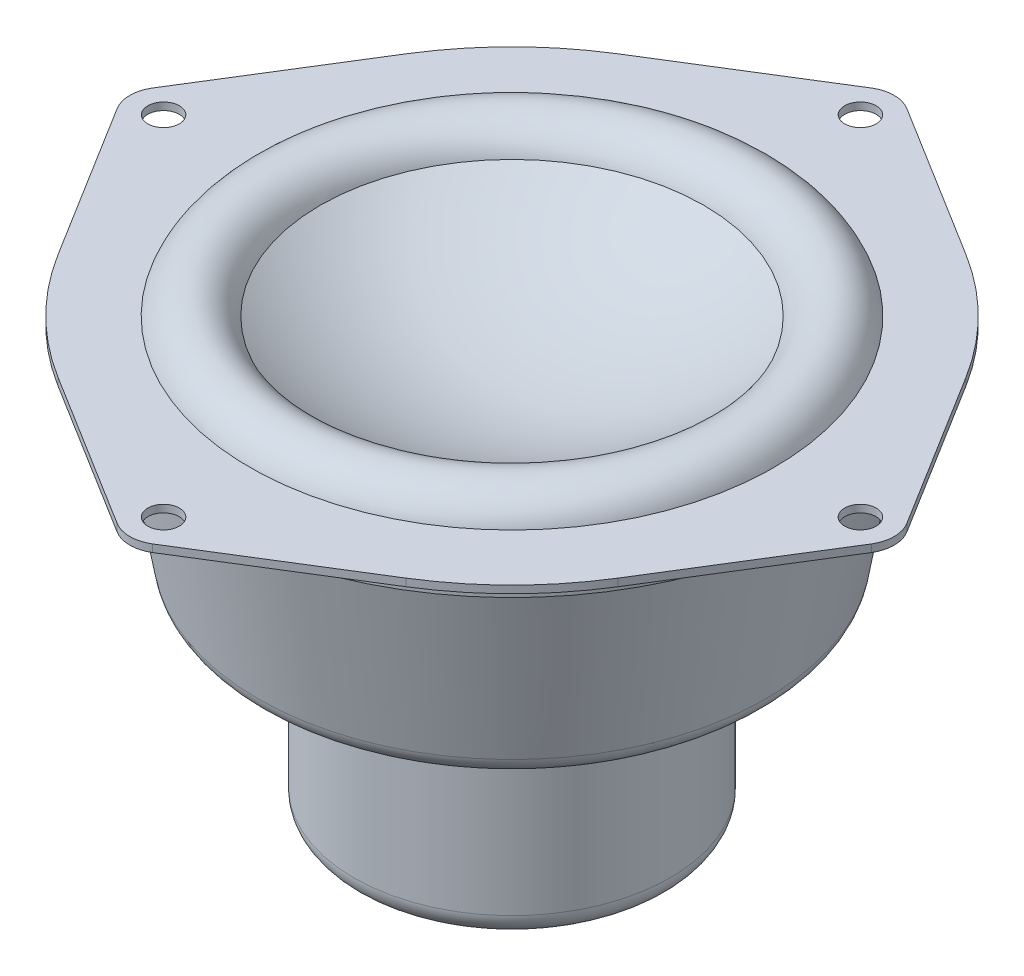
ISO-10303-21;
HEADER;
FILE_DESCRIPTION(('STEP AP214'),'2;1');
FILE_NAME('part.step','',(''),(''),'','','');
FILE_SCHEMA(('AUTOMOTIVE_DESIGN { 1 0 10303 214 1 1 1 1 }'));
ENDSEC;
DATA;
#1=APPLICATION_CONTEXT('core data for automotive mechanical design processes');
#2=APPLICATION_PROTOCOL_DEFINITION('international standard','automotive_design',2000,#1);
#3=PRODUCT_CONTEXT('',#1,'mechanical');
#4=PRODUCT('Part','Part','',(#3));
#5=PRODUCT_RELATED_PRODUCT_CATEGORY('part','',(#4));
#6=PRODUCT_DEFINITION_FORMATION('','',#4);
#7=PRODUCT_DEFINITION_CONTEXT('part definition',#1,'design');
#8=PRODUCT_DEFINITION('design','',#6,#7);
#9=PRODUCT_DEFINITION_SHAPE('','',#8);
#10=(LENGTH_UNIT() NAMED_UNIT(*) SI_UNIT(.MILLI.,.METRE.));
#11=(NAMED_UNIT(*) PLANE_ANGLE_UNIT() SI_UNIT($,.RADIAN.));
#12=(NAMED_UNIT(*) SI_UNIT($,.STERADIAN.) SOLID_ANGLE_UNIT());
#13=UNCERTAINTY_MEASURE_WITH_UNIT(LENGTH_MEASURE(1.E-05),#10,'distance_accuracy_value','');
#14=(GEOMETRIC_REPRESENTATION_CONTEXT(3) GLOBAL_UNCERTAINTY_ASSIGNED_CONTEXT((#13)) GLOBAL_UNIT_ASSIGNED_CONTEXT((#10,
#11,#12)) REPRESENTATION_CONTEXT('',''));
#15=CARTESIAN_POINT('',(0.,0.,0.));
#16=DIRECTION('',(0.,0.,1.));
#17=DIRECTION('',(1.,0.,0.));
#18=AXIS2_PLACEMENT_3D('',#15,#16,#17);
#19=CARTESIAN_POINT('',(0.,57.4,0.));
#20=DIRECTION('',(0.,1.,0.));
#21=DIRECTION('',(0.,0.,1.));
#22=AXIS2_PLACEMENT_3D('',#19,#20,#21);
#23=PLANE('',#22);
#24=CARTESIAN_POINT('',(0.,57.4,-46.5));
#25=DIRECTION('',(0.,1.,0.));
#26=DIRECTION('',(0.,0.,1.));
#27=AXIS2_PLACEMENT_3D('',#24,#25,#26);
#28=CIRCLE('',#27,2.1);
#29=CARTESIAN_POINT('',(0.,57.4,-44.4));
#30=VERTEX_POINT('',#29);
#31=EDGE_CURVE('E247',#30,#30,#28,.T.);
#32=ORIENTED_EDGE('',*,*,#31,.F.);
#33=EDGE_LOOP('',(#32));
#34=FACE_BOUND('',#33,.T.);
#35=CARTESIAN_POINT('',(46.5,57.4,-4.87061646768617E-13));
#36=DIRECTION('',(0.,1.,0.));
#37=DIRECTION('',(-1.,0.,0.));
#38=AXIS2_PLACEMENT_3D('',#35,#36,#37);
#39=CIRCLE('',#38,2.1);
#40=CARTESIAN_POINT('',(44.4,57.4,-4.65065314333905E-13));
#41=VERTEX_POINT('',#40);
#42=EDGE_CURVE('E179',#41,#41,#39,.T.);
#43=ORIENTED_EDGE('',*,*,#42,.F.);
#44=EDGE_LOOP('',(#43));
#45=FACE_BOUND('',#44,.T.);
#46=CARTESIAN_POINT('',(-46.5,57.4,1.62353882256206E-13));
#47=DIRECTION('',(0.,1.,0.));
#48=DIRECTION('',(1.,0.,0.));
#49=AXIS2_PLACEMENT_3D('',#46,#47,#48);
#50=CIRCLE('',#49,2.1);
#51=CARTESIAN_POINT('',(-44.4,57.4,1.55021771444635E-13));
#52=VERTEX_POINT('',#51);
#53=EDGE_CURVE('E217',#52,#52,#50,.T.);
#54=ORIENTED_EDGE('',*,*,#53,.F.);
#55=EDGE_LOOP('',(#54));
#56=FACE_BOUND('',#55,.T.);
#57=CARTESIAN_POINT('',(0.,57.4,46.5));
#58=DIRECTION('',(0.,1.,0.));
#59=DIRECTION('',(0.,0.,-1.));
#60=AXIS2_PLACEMENT_3D('',#57,#58,#59);
#61=CIRCLE('',#60,2.1);
#62=CARTESIAN_POINT('',(0.,57.4,44.4));
#63=VERTEX_POINT('',#62);
#64=EDGE_CURVE('E187',#63,#63,#61,.T.);
#65=ORIENTED_EDGE('',*,*,#64,.F.);
#66=EDGE_LOOP('',(#65));
#67=FACE_BOUND('',#66,.T.);
#68=CARTESIAN_POINT('',(0.,57.4,0.));
#69=DIRECTION('',(0.,1.,0.));
#70=DIRECTION('',(0.,0.,1.));
#71=AXIS2_PLACEMENT_3D('',#68,#69,#70);
#72=CIRCLE('',#71,44.);
#73=CARTESIAN_POINT('',(37.3763440860212,57.4,-23.216565266278));
#74=VERTEX_POINT('',#73);
#75=CARTESIAN_POINT('',(23.2165652662776,57.4,-37.3763440860215));
#76=VERTEX_POINT('',#75);
#77=EDGE_CURVE('E51',#74,#76,#72,.T.);
#78=ORIENTED_EDGE('',*,*,#77,.T.);
#79=DIRECTION('',(-0.849462365591398,0.,-0.527649210597218));
#80=VECTOR('',#79,1.);
#81=CARTESIAN_POINT('',(2.37442144768748,57.4,-50.3225806451613));
#82=LINE('',#81,#80);
#83=CARTESIAN_POINT('',(2.37442144768748,57.4,-50.3225806451613));
#84=VERTEX_POINT('',#83);
#85=EDGE_CURVE('E256',#76,#84,#82,.T.);
#86=ORIENTED_EDGE('',*,*,#85,.T.);
#87=CARTESIAN_POINT('',(0.,57.4,-46.5));
#88=DIRECTION('',(0.,1.,0.));
#89=DIRECTION('',(0.,0.,-1.));
#90=AXIS2_PLACEMENT_3D('',#87,#88,#89);
#91=CIRCLE('',#90,4.5);
#92=CARTESIAN_POINT('',(-2.37442144768748,57.4,-50.3225806451613));
#93=VERTEX_POINT('',#92);
#94=EDGE_CURVE('E259',#84,#93,#91,.T.);
#95=ORIENTED_EDGE('',*,*,#94,.T.);
#96=DIRECTION('',(-0.849462365591398,0.,0.527649210597218));
#97=VECTOR('',#96,1.);
#98=CARTESIAN_POINT('',(-23.2165652662776,57.4,-37.3763440860215));
#99=LINE('',#98,#97);
#100=CARTESIAN_POINT('',(-23.2165652662776,57.4,-37.3763440860215));
#101=VERTEX_POINT('',#100);
#102=EDGE_CURVE('E261',#93,#101,#99,.T.);
#103=ORIENTED_EDGE('',*,*,#102,.T.);
#104=CARTESIAN_POINT('',(-37.3763440860216,57.4,-23.2165652662774));
#105=VERTEX_POINT('',#104);
#106=EDGE_CURVE('E253',#101,#105,#72,.T.);
#107=ORIENTED_EDGE('',*,*,#106,.T.);
#108=DIRECTION('',(-0.527649210597215,0.,0.8494623655914));
#109=VECTOR('',#108,1.);
#110=CARTESIAN_POINT('',(-50.3225806451613,57.4,-2.3744214476873));
#111=LINE('',#110,#109);
#112=CARTESIAN_POINT('',(-50.3225806451613,57.4,-2.3744214476873));
#113=VERTEX_POINT('',#112);
#114=EDGE_CURVE('E223',#105,#113,#111,.T.);
#115=ORIENTED_EDGE('',*,*,#114,.T.);
#116=CARTESIAN_POINT('',(-46.5,57.4,1.62353882256206E-13));
#117=DIRECTION('',(0.,1.,0.));
#118=DIRECTION('',(-1.,0.,0.));
#119=AXIS2_PLACEMENT_3D('',#116,#117,#118);
#120=CIRCLE('',#119,4.5);
#121=CARTESIAN_POINT('',(-50.3225806451613,57.4,2.37442144768765));
#122=VERTEX_POINT('',#121);
#123=EDGE_CURVE('E225',#113,#122,#120,.T.);
#124=ORIENTED_EDGE('',*,*,#123,.T.);
#125=DIRECTION('',(0.527649210597221,0.,0.849462365591396));
#126=VECTOR('',#125,1.);
#127=CARTESIAN_POINT('',(-37.3763440860214,57.4,23.2165652662777));
#128=LINE('',#127,#126);
#129=CARTESIAN_POINT('',(-37.3763440860214,57.4,23.2165652662777));
#130=VERTEX_POINT('',#129);
#131=EDGE_CURVE('E228',#122,#130,#128,.T.);
#132=ORIENTED_EDGE('',*,*,#131,.T.);
#133=CARTESIAN_POINT('',(-23.2165652662776,57.4,37.3763440860215));
#134=VERTEX_POINT('',#133);
#135=EDGE_CURVE('E257',#130,#134,#72,.T.);
#136=ORIENTED_EDGE('',*,*,#135,.T.);
#137=DIRECTION('',(0.849462365591398,0.,0.527649210597218));
#138=VECTOR('',#137,1.);
#139=CARTESIAN_POINT('',(-2.37442144768748,57.4,50.3225806451613));
#140=LINE('',#139,#138);
#141=CARTESIAN_POINT('',(-2.37442144768748,57.4,50.3225806451613));
#142=VERTEX_POINT('',#141);
#143=EDGE_CURVE('E193',#134,#142,#140,.T.);
#144=ORIENTED_EDGE('',*,*,#143,.T.);
#145=CARTESIAN_POINT('',(0.,57.4,46.5));
#146=DIRECTION('',(0.,1.,0.));
#147=DIRECTION('',(0.,0.,1.));
#148=AXIS2_PLACEMENT_3D('',#145,#146,#147);
#149=CIRCLE('',#148,4.5);
#150=CARTESIAN_POINT('',(2.37442144768748,57.4,50.3225806451613));
#151=VERTEX_POINT('',#150);
#152=EDGE_CURVE('E195',#142,#151,#149,.T.);
#153=ORIENTED_EDGE('',*,*,#152,.T.);
#154=DIRECTION('',(0.849462365591398,0.,-0.527649210597218));
#155=VECTOR('',#154,1.);
#156=CARTESIAN_POINT('',(23.2165652662776,57.4,37.3763440860215));
#157=LINE('',#156,#155);
#158=CARTESIAN_POINT('',(23.2165652662776,57.4,37.3763440860215));
#159=VERTEX_POINT('',#158);
#160=EDGE_CURVE('E198',#151,#159,#157,.T.);
#161=ORIENTED_EDGE('',*,*,#160,.T.);
#162=CARTESIAN_POINT('',(37.3763440860217,57.4,23.2165652662772));
#163=VERTEX_POINT('',#162);
#164=EDGE_CURVE('E155',#159,#163,#72,.T.);
#165=ORIENTED_EDGE('',*,*,#164,.T.);
#166=DIRECTION('',(0.527649210597209,0.,-0.849462365591403));
#167=VECTOR('',#166,1.);
#168=CARTESIAN_POINT('',(50.3225806451613,57.4,2.37442144768695));
#169=LINE('',#168,#167);
#170=CARTESIAN_POINT('',(50.3225806451613,57.4,2.37442144768695));
#171=VERTEX_POINT('',#170);
#172=EDGE_CURVE('E149',#163,#171,#169,.T.);
#173=ORIENTED_EDGE('',*,*,#172,.T.);
#174=CARTESIAN_POINT('',(46.5,57.4,-4.87061646768617E-13));
#175=DIRECTION('',(0.,1.,0.));
#176=DIRECTION('',(1.,0.,0.));
#177=AXIS2_PLACEMENT_3D('',#174,#175,#176);
#178=CIRCLE('',#177,4.5);
#179=CARTESIAN_POINT('',(50.3225806451613,57.4,-2.37442144768801));
#180=VERTEX_POINT('',#179);
#181=EDGE_CURVE('E153',#171,#180,#178,.T.);
#182=ORIENTED_EDGE('',*,*,#181,.T.);
#183=DIRECTION('',(-0.527649210597226,0.,-0.849462365591392));
#184=VECTOR('',#183,1.);
#185=CARTESIAN_POINT('',(37.3763440860212,57.4,-23.216565266278));
#186=LINE('',#185,#184);
#187=EDGE_CURVE('E171',#180,#74,#186,.T.);
#188=ORIENTED_EDGE('',*,*,#187,.T.);
#189=EDGE_LOOP('',(#78,#86,#95,#103,#107,#115,#124,#132,#136,#144,#153,#161,#165,#173,#182,#188));
#190=FACE_BOUND('',#189,.T.);
#191=CARTESIAN_POINT('',(0.,57.4000000000023,-5.26922255828103E-13));
#192=DIRECTION('',(0.,-1.,0.));
#193=DIRECTION('',(0.,0.,-1.));
#194=AXIS2_PLACEMENT_3D('',#191,#192,#193);
#195=CIRCLE('',#194,34.9999999999995);
#196=CARTESIAN_POINT('',(0.,57.4,-35.));
#197=VERTEX_POINT('',#196);
#198=EDGE_CURVE('E657',#197,#197,#195,.T.);
#199=ORIENTED_EDGE('',*,*,#198,.T.);
#200=EDGE_LOOP('',(#199));
#201=FACE_BOUND('',#200,.T.);
#202=ADVANCED_FACE('F36',(#34,#45,#56,#67,#190,#201),#23,.T.);
#203=CARTESIAN_POINT('',(0.,57.4,0.));
#204=DIRECTION('',(0.,-1.,0.));
#205=DIRECTION('',(0.,0.,-1.));
#206=AXIS2_PLACEMENT_3D('',#203,#204,#205);
#207=CYLINDRICAL_SURFACE('',#206,44.);
#208=DIRECTION('',(0.,-1.,0.));
#209=VECTOR('',#208,1.);
#210=CARTESIAN_POINT('',(-37.3763440860216,57.4,-23.2165652662774));
#211=LINE('',#210,#209);
#212=CARTESIAN_POINT('',(-37.3763440860216,56.4,-23.2165652662774));
#213=VERTEX_POINT('',#212);
#214=EDGE_CURVE('E243',#105,#213,#211,.T.);
#215=ORIENTED_EDGE('',*,*,#214,.F.);
#216=ORIENTED_EDGE('',*,*,#106,.F.);
#217=DIRECTION('',(0.,-1.,0.));
#218=VECTOR('',#217,1.);
#219=CARTESIAN_POINT('',(-23.2165652662776,57.4,-37.3763440860215));
#220=LINE('',#219,#218);
#221=CARTESIAN_POINT('',(-23.2165652662776,56.4,-37.3763440860215));
#222=VERTEX_POINT('',#221);
#223=EDGE_CURVE('E263',#101,#222,#220,.T.);
#224=ORIENTED_EDGE('',*,*,#223,.T.);
#225=CARTESIAN_POINT('',(0.,56.4,0.));
#226=DIRECTION('',(0.,1.,0.));
#227=DIRECTION('',(0.,0.,1.));
#228=AXIS2_PLACEMENT_3D('',#225,#226,#227);
#229=CIRCLE('',#228,44.);
#230=EDGE_CURVE('E264',#222,#213,#229,.T.);
#231=ORIENTED_EDGE('',*,*,#230,.T.);
#232=EDGE_LOOP('',(#215,#216,#224,#231));
#233=FACE_BOUND('',#232,.T.);
#234=ADVANCED_FACE('F324',(#233),#207,.T.);
#235=DIRECTION('',(0.,-1.,0.));
#236=VECTOR('',#235,1.);
#237=CARTESIAN_POINT('',(37.3763440860217,57.4,23.2165652662772));
#238=LINE('',#237,#236);
#239=CARTESIAN_POINT('',(37.3763440860217,56.4,23.2165652662772));
#240=VERTEX_POINT('',#239);
#241=EDGE_CURVE('E59',#163,#240,#238,.T.);
#242=ORIENTED_EDGE('',*,*,#241,.F.);
#243=ORIENTED_EDGE('',*,*,#164,.F.);
#244=DIRECTION('',(0.,-1.,0.));
#245=VECTOR('',#244,1.);
#246=CARTESIAN_POINT('',(23.2165652662776,57.4,37.3763440860215));
#247=LINE('',#246,#245);
#248=CARTESIAN_POINT('',(23.2165652662776,56.4,37.3763440860215));
#249=VERTEX_POINT('',#248);
#250=EDGE_CURVE('E200',#159,#249,#247,.T.);
#251=ORIENTED_EDGE('',*,*,#250,.T.);
#252=EDGE_CURVE('E618',#249,#240,#229,.T.);
#253=ORIENTED_EDGE('',*,*,#252,.T.);
#254=EDGE_LOOP('',(#242,#243,#251,#253));
#255=FACE_BOUND('',#254,.T.);
#256=ADVANCED_FACE('F330',(#255),#207,.T.);
#257=ORIENTED_EDGE('',*,*,#135,.F.);
#258=DIRECTION('',(0.,-1.,0.));
#259=VECTOR('',#258,1.);
#260=CARTESIAN_POINT('',(-37.3763440860214,57.4,23.2165652662777));
#261=LINE('',#260,#259);
#262=CARTESIAN_POINT('',(-37.3763440860214,56.4,23.2165652662777));
#263=VERTEX_POINT('',#262);
#264=EDGE_CURVE('E230',#130,#263,#261,.T.);
#265=ORIENTED_EDGE('',*,*,#264,.T.);
#266=CARTESIAN_POINT('',(-23.2165652662776,56.4,37.3763440860215));
#267=VERTEX_POINT('',#266);
#268=EDGE_CURVE('E268',#263,#267,#229,.T.);
#269=ORIENTED_EDGE('',*,*,#268,.T.);
#270=DIRECTION('',(0.,-1.,0.));
#271=VECTOR('',#270,1.);
#272=CARTESIAN_POINT('',(-23.2165652662776,57.4,37.3763440860215));
#273=LINE('',#272,#271);
#274=EDGE_CURVE('E213',#134,#267,#273,.T.);
#275=ORIENTED_EDGE('',*,*,#274,.F.);
#276=EDGE_LOOP('',(#257,#265,#269,#275));
#277=FACE_BOUND('',#276,.T.);
#278=ADVANCED_FACE('F358',(#277),#207,.T.);
#279=CARTESIAN_POINT('',(0.,27.6,0.));
#280=DIRECTION('',(0.,-1.,0.));
#281=DIRECTION('',(0.,0.,-1.));
#282=AXIS2_PLACEMENT_3D('',#279,#280,#281);
#283=CYLINDRICAL_SURFACE('',#282,21.1);
#284=CARTESIAN_POINT('',(0.,3.,0.));
#285=DIRECTION('',(0.,1.,0.));
#286=DIRECTION('',(0.,0.,1.));
#287=AXIS2_PLACEMENT_3D('',#284,#285,#286);
#288=CIRCLE('',#287,21.1);
#289=CARTESIAN_POINT('',(0.,3.,-21.1));
#290=VERTEX_POINT('',#289);
#291=EDGE_CURVE('E297',#290,#290,#288,.T.);
#292=CARTESIAN_POINT('',(0.,27.6,0.));
#293=DIRECTION('',(0.,1.,0.));
#294=DIRECTION('',(0.,0.,1.));
#295=AXIS2_PLACEMENT_3D('',#292,#293,#294);
#296=CIRCLE('',#295,21.1);
#297=CARTESIAN_POINT('',(0.,27.6,-21.1));
#298=VERTEX_POINT('',#297);
#299=EDGE_CURVE('E294',#298,#298,#296,.T.);
#300=CARTESIAN_POINT('',(0.,3.,-21.1));
#301=CARTESIAN_POINT('',(0.,3.25625,-21.1));
#302=CARTESIAN_POINT('',(0.,3.51249999999999,-21.1));
#303=CARTESIAN_POINT('',(0.,4.025,-21.1));
#304=CARTESIAN_POINT('',(0.,4.28125,-21.1));
#305=CARTESIAN_POINT('',(0.,4.79375,-21.1));
#306=CARTESIAN_POINT('',(0.,5.05,-21.1));
#307=CARTESIAN_POINT('',(0.,5.5625,-21.1));
#308=CARTESIAN_POINT('',(0.,5.81875,-21.1));
#309=CARTESIAN_POINT('',(0.,6.33125,-21.1));
#310=CARTESIAN_POINT('',(0.,6.5875,-21.1));
#311=CARTESIAN_POINT('',(0.,7.1,-21.1));
#312=CARTESIAN_POINT('',(0.,7.35625,-21.1));
#313=CARTESIAN_POINT('',(0.,7.86875,-21.1));
#314=CARTESIAN_POINT('',(0.,8.125,-21.1));
#315=CARTESIAN_POINT('',(0.,8.6375,-21.1));
#316=CARTESIAN_POINT('',(0.,8.89375,-21.1));
#317=CARTESIAN_POINT('',(0.,9.40625,-21.1));
#318=CARTESIAN_POINT('',(0.,9.6625,-21.1));
#319=CARTESIAN_POINT('',(0.,10.175,-21.1));
#320=CARTESIAN_POINT('',(0.,10.43125,-21.1));
#321=CARTESIAN_POINT('',(0.,10.94375,-21.1));
#322=CARTESIAN_POINT('',(0.,11.2,-21.1));
#323=CARTESIAN_POINT('',(0.,11.7125,-21.1));
#324=CARTESIAN_POINT('',(0.,11.96875,-21.1));
#325=CARTESIAN_POINT('',(0.,12.48125,-21.1));
#326=CARTESIAN_POINT('',(0.,12.7375,-21.1));
#327=CARTESIAN_POINT('',(0.,13.25,-21.1));
#328=CARTESIAN_POINT('',(0.,13.50625,-21.1));
#329=CARTESIAN_POINT('',(0.,14.01875,-21.1));
#330=CARTESIAN_POINT('',(0.,14.275,-21.1));
#331=CARTESIAN_POINT('',(0.,14.7875,-21.1));
#332=CARTESIAN_POINT('',(0.,15.04375,-21.1));
#333=CARTESIAN_POINT('',(0.,15.55625,-21.1));
#334=CARTESIAN_POINT('',(0.,15.8125,-21.1));
#335=CARTESIAN_POINT('',(0.,16.325,-21.1));
#336=CARTESIAN_POINT('',(0.,16.58125,-21.1));
#337=CARTESIAN_POINT('',(0.,17.09375,-21.1));
#338=CARTESIAN_POINT('',(0.,17.35,-21.1));
#339=CARTESIAN_POINT('',(0.,17.8625,-21.1));
#340=CARTESIAN_POINT('',(0.,18.11875,-21.1));
#341=CARTESIAN_POINT('',(0.,18.63125,-21.1));
#342=CARTESIAN_POINT('',(0.,18.8875,-21.1));
#343=CARTESIAN_POINT('',(0.,19.4,-21.1));
#344=CARTESIAN_POINT('',(0.,19.65625,-21.1));
#345=CARTESIAN_POINT('',(0.,20.16875,-21.1));
#346=CARTESIAN_POINT('',(0.,20.425,-21.1));
#347=CARTESIAN_POINT('',(0.,20.9375,-21.1));
#348=CARTESIAN_POINT('',(0.,21.19375,-21.1));
#349=CARTESIAN_POINT('',(0.,21.70625,-21.1));
#350=CARTESIAN_POINT('',(0.,21.9625,-21.1));
#351=CARTESIAN_POINT('',(0.,22.475,-21.1));
#352=CARTESIAN_POINT('',(0.,22.73125,-21.1));
#353=CARTESIAN_POINT('',(0.,23.24375,-21.1));
#354=CARTESIAN_POINT('',(0.,23.5,-21.1));
#355=CARTESIAN_POINT('',(0.,24.0125,-21.1));
#356=CARTESIAN_POINT('',(0.,24.26875,-21.1));
#357=CARTESIAN_POINT('',(0.,24.78125,-21.1));
#358=CARTESIAN_POINT('',(0.,25.0375,-21.1));
#359=CARTESIAN_POINT('',(0.,25.55,-21.1));
#360=CARTESIAN_POINT('',(0.,25.80625,-21.1));
#361=CARTESIAN_POINT('',(0.,26.31875,-21.1));
#362=CARTESIAN_POINT('',(0.,26.575,-21.1));
#363=CARTESIAN_POINT('',(0.,27.0875,-21.1));
#364=CARTESIAN_POINT('',(0.,27.34375,-21.1));
#365=CARTESIAN_POINT('',(0.,27.6,-21.1));
#366=B_SPLINE_CURVE_WITH_KNOTS('',3,(#300,#301,#302,#303,#304,#305,#306,#307,#308,#309,#310,
#311,#312,#313,#314,#315,#316,#317,#318,#319,#320,#321,#322,#323,#324,#325,#326,#327,#328,#329,
#330,#331,#332,#333,#334,#335,#336,#337,#338,#339,#340,#341,#342,#343,#344,#345,#346,#347,#348,
#349,#350,#351,#352,#353,#354,#355,#356,#357,#358,#359,#360,#361,#362,#363,#364,#365),
.UNSPECIFIED.,.F.,.F.,(4,2,2,2,2,2,2,2,2,2,2,2,2,2,2,2,2,2,2,2,2,2,2,2,2,2,2,2,2,2,2,2,4),(0.,
0.768749999999999,1.5375,2.30625,3.075,3.84375,4.6125,5.38125,6.15,6.91875,7.6875,8.45625,9.225,
9.99375,10.7625,11.53125,12.3,13.06875,13.8375,14.60625,15.375,16.14375,16.9125,17.68125,18.45,
19.21875,19.9875,20.75625,21.525,22.29375,23.0625,23.83125,24.6),.UNSPECIFIED.);
#367=EDGE_CURVE('BSEAM373',#290,#298,#366,.T.);
#368=ORIENTED_EDGE('',*,*,#291,.T.);
#369=ORIENTED_EDGE('',*,*,#299,.F.);
#370=ORIENTED_EDGE('',*,*,#367,.T.);
#371=ORIENTED_EDGE('',*,*,#367,.F.);
#372=EDGE_LOOP('',(#368,#370,#369,#371));
#373=FACE_BOUND('',#372,.T.);
#374=ADVANCED_FACE('F373',(#373),#283,.T.);
#375=CARTESIAN_POINT('',(0.,0.,0.));
#376=DIRECTION('',(0.,1.,0.));
#377=DIRECTION('',(0.,0.,1.));
#378=AXIS2_PLACEMENT_3D('',#375,#376,#377);
#379=PLANE('',#378);
#380=CARTESIAN_POINT('',(0.,0.,0.));
#381=DIRECTION('',(0.,1.,0.));
#382=DIRECTION('',(0.,0.,1.));
#383=AXIS2_PLACEMENT_3D('',#380,#381,#382);
#384=CIRCLE('',#383,18.1);
#385=CARTESIAN_POINT('',(0.,0.,18.1));
#386=VERTEX_POINT('',#385);
#387=EDGE_CURVE('E300',#386,#386,#384,.F.);
#388=ORIENTED_EDGE('',*,*,#387,.T.);
#389=EDGE_LOOP('',(#388));
#390=FACE_BOUND('',#389,.T.);
#391=ADVANCED_FACE('F370',(#390),#379,.F.);
#392=CARTESIAN_POINT('',(0.,54.9,0.));
#393=DIRECTION('',(0.,1.,0.));
#394=DIRECTION('',(0.,0.,1.));
#395=AXIS2_PLACEMENT_3D('',#392,#393,#394);
#396=CONICAL_SURFACE('',#395,38.25,0.174532925199433);
#397=CARTESIAN_POINT('',(0.,30.0790554669992,0.));
#398=DIRECTION('',(0.,-1.,0.));
#399=DIRECTION('',(0.,0.,-1.));
#400=AXIS2_PLACEMENT_3D('',#397,#398,#399);
#401=CIRCLE('',#400,33.8733977921637);
#402=CARTESIAN_POINT('',(0.,30.0790554669992,-33.8733977921637));
#403=VERTEX_POINT('',#402);
#404=EDGE_CURVE('E44',#403,#403,#401,.F.);
#405=ORIENTED_EDGE('',*,*,#404,.T.);
#406=EDGE_LOOP('',(#405));
#407=FACE_BOUND('',#406,.T.);
#408=CARTESIAN_POINT('',(0.,54.9,0.));
#409=DIRECTION('',(0.,1.,0.));
#410=DIRECTION('',(0.,0.,1.));
#411=AXIS2_PLACEMENT_3D('',#408,#409,#410);
#412=CIRCLE('',#411,38.25);
#413=CARTESIAN_POINT('',(0.,54.9,38.25));
#414=VERTEX_POINT('',#413);
#415=EDGE_CURVE('E291',#414,#414,#412,.T.);
#416=ORIENTED_EDGE('',*,*,#415,.F.);
#417=EDGE_LOOP('',(#416));
#418=FACE_BOUND('',#417,.T.);
#419=ADVANCED_FACE('F305',(#407,#418),#396,.T.);
#420=CARTESIAN_POINT('',(0.,27.6,0.));
#421=DIRECTION('',(0.,1.,0.));
#422=DIRECTION('',(0.,0.,1.));
#423=AXIS2_PLACEMENT_3D('',#420,#421,#422);
#424=PLANE('',#423);
#425=CARTESIAN_POINT('',(0.,27.6,0.));
#426=DIRECTION('',(0.,1.,0.));
#427=DIRECTION('',(0.,0.,1.));
#428=AXIS2_PLACEMENT_3D('',#425,#426,#427);
#429=CIRCLE('',#428,30.9189745331271);
#430=CARTESIAN_POINT('',(0.,27.6,30.9189745331271));
#431=VERTEX_POINT('',#430);
#432=EDGE_CURVE('E12',#431,#431,#429,.F.);
#433=ORIENTED_EDGE('',*,*,#432,.T.);
#434=EDGE_LOOP('',(#433));
#435=FACE_BOUND('',#434,.T.);
#436=ORIENTED_EDGE('',*,*,#299,.T.);
#437=EDGE_LOOP('',(#436));
#438=FACE_BOUND('',#437,.T.);
#439=ADVANCED_FACE('F365',(#435,#438),#424,.F.);
#440=CARTESIAN_POINT('',(0.,233.008152801713,0.));
#441=DIRECTION('',(0.,-1.,0.));
#442=DIRECTION('',(0.,0.,-1.));
#443=AXIS2_PLACEMENT_3D('',#440,#441,#442);
#444=CYLINDRICAL_SURFACE('',#443,42.5);
#445=CARTESIAN_POINT('',(0.,54.9,0.));
#446=DIRECTION('',(0.,1.,0.));
#447=DIRECTION('',(0.,0.,1.));
#448=AXIS2_PLACEMENT_3D('',#445,#446,#447);
#449=CIRCLE('',#448,42.5);
#450=CARTESIAN_POINT('',(0.,54.9,42.5));
#451=VERTEX_POINT('',#450);
#452=EDGE_CURVE('E285',#451,#451,#449,.T.);
#453=ORIENTED_EDGE('',*,*,#452,.T.);
#454=EDGE_LOOP('',(#453));
#455=FACE_BOUND('',#454,.T.);
#456=CARTESIAN_POINT('',(0.,56.4,0.));
#457=DIRECTION('',(0.,1.,0.));
#458=DIRECTION('',(0.,0.,1.));
#459=AXIS2_PLACEMENT_3D('',#456,#457,#458);
#460=CIRCLE('',#459,42.5);
#461=CARTESIAN_POINT('',(0.,56.4,42.5));
#462=VERTEX_POINT('',#461);
#463=EDGE_CURVE('E288',#462,#462,#460,.T.);
#464=ORIENTED_EDGE('',*,*,#463,.F.);
#465=EDGE_LOOP('',(#464));
#466=FACE_BOUND('',#465,.T.);
#467=ADVANCED_FACE('F361',(#455,#466),#444,.T.);
#468=CARTESIAN_POINT('',(0.,54.9,0.));
#469=DIRECTION('',(0.,1.,0.));
#470=DIRECTION('',(0.,0.,1.));
#471=AXIS2_PLACEMENT_3D('',#468,#469,#470);
#472=PLANE('',#471);
#473=ORIENTED_EDGE('',*,*,#415,.T.);
#474=EDGE_LOOP('',(#473));
#475=FACE_BOUND('',#474,.T.);
#476=ORIENTED_EDGE('',*,*,#452,.F.);
#477=EDGE_LOOP('',(#476));
#478=FACE_BOUND('',#477,.T.);
#479=ADVANCED_FACE('F343',(#475,#478),#472,.F.);
#480=CARTESIAN_POINT('',(0.,56.4,0.));
#481=DIRECTION('',(0.,1.,0.));
#482=DIRECTION('',(0.,0.,1.));
#483=AXIS2_PLACEMENT_3D('',#480,#481,#482);
#484=PLANE('',#483);
#485=ORIENTED_EDGE('',*,*,#463,.T.);
#486=EDGE_LOOP('',(#485));
#487=FACE_BOUND('',#486,.T.);
#488=ORIENTED_EDGE('',*,*,#230,.F.);
#489=DIRECTION('',(-0.849462365591398,0.,0.527649210597218));
#490=VECTOR('',#489,1.);
#491=CARTESIAN_POINT('',(-23.2165652662776,56.4,-37.3763440860215));
#492=LINE('',#491,#490);
#493=CARTESIAN_POINT('',(-2.37442144768748,56.4,-50.3225806451613));
#494=VERTEX_POINT('',#493);
#495=EDGE_CURVE('E272',#494,#222,#492,.T.);
#496=ORIENTED_EDGE('',*,*,#495,.F.);
#497=CARTESIAN_POINT('',(0.,56.4,-46.5));
#498=DIRECTION('',(0.,1.,0.));
#499=DIRECTION('',(0.,0.,-1.));
#500=AXIS2_PLACEMENT_3D('',#497,#498,#499);
#501=CIRCLE('',#500,4.5);
#502=CARTESIAN_POINT('',(2.37442144768748,56.4,-50.3225806451613));
#503=VERTEX_POINT('',#502);
#504=EDGE_CURVE('E270',#503,#494,#501,.T.);
#505=ORIENTED_EDGE('',*,*,#504,.F.);
#506=DIRECTION('',(-0.849462365591398,0.,-0.527649210597218));
#507=VECTOR('',#506,1.);
#508=CARTESIAN_POINT('',(2.37442144768748,56.4,-50.3225806451613));
#509=LINE('',#508,#507);
#510=CARTESIAN_POINT('',(23.2165652662776,56.4,-37.3763440860215));
#511=VERTEX_POINT('',#510);
#512=EDGE_CURVE('E267',#511,#503,#509,.T.);
#513=ORIENTED_EDGE('',*,*,#512,.F.);
#514=CARTESIAN_POINT('',(37.3763440860212,56.4,-23.216565266278));
#515=VERTEX_POINT('',#514);
#516=EDGE_CURVE('E250',#515,#511,#229,.T.);
#517=ORIENTED_EDGE('',*,*,#516,.F.);
#518=DIRECTION('',(-0.527649210597226,0.,-0.849462365591392));
#519=VECTOR('',#518,1.);
#520=CARTESIAN_POINT('',(37.3763440860212,56.4,-23.216565266278));
#521=LINE('',#520,#519);
#522=CARTESIAN_POINT('',(50.3225806451613,56.4,-2.37442144768801));
#523=VERTEX_POINT('',#522);
#524=EDGE_CURVE('E157',#523,#515,#521,.T.);
#525=ORIENTED_EDGE('',*,*,#524,.F.);
#526=CARTESIAN_POINT('',(46.5,56.4,-4.87061646768617E-13));
#527=DIRECTION('',(0.,1.,0.));
#528=DIRECTION('',(1.,0.,0.));
#529=AXIS2_PLACEMENT_3D('',#526,#527,#528);
#530=CIRCLE('',#529,4.5);
#531=CARTESIAN_POINT('',(50.3225806451613,56.4,2.37442144768695));
#532=VERTEX_POINT('',#531);
#533=EDGE_CURVE('E178',#532,#523,#530,.T.);
#534=ORIENTED_EDGE('',*,*,#533,.F.);
#535=DIRECTION('',(0.527649210597209,0.,-0.849462365591403));
#536=VECTOR('',#535,1.);
#537=CARTESIAN_POINT('',(50.3225806451613,56.4,2.37442144768695));
#538=LINE('',#537,#536);
#539=EDGE_CURVE('E163',#240,#532,#538,.T.);
#540=ORIENTED_EDGE('',*,*,#539,.F.);
#541=ORIENTED_EDGE('',*,*,#252,.F.);
#542=DIRECTION('',(0.849462365591398,0.,-0.527649210597218));
#543=VECTOR('',#542,1.);
#544=CARTESIAN_POINT('',(23.2165652662776,56.4,37.3763440860215));
#545=LINE('',#544,#543);
#546=CARTESIAN_POINT('',(2.37442144768748,56.4,50.3225806451613));
#547=VERTEX_POINT('',#546);
#548=EDGE_CURVE('E196',#547,#249,#545,.T.);
#549=ORIENTED_EDGE('',*,*,#548,.F.);
#550=CARTESIAN_POINT('',(0.,56.4,46.5));
#551=DIRECTION('',(0.,1.,0.));
#552=DIRECTION('',(0.,0.,1.));
#553=AXIS2_PLACEMENT_3D('',#550,#551,#552);
#554=CIRCLE('',#553,4.5);
#555=CARTESIAN_POINT('',(-2.37442144768748,56.4,50.3225806451613));
#556=VERTEX_POINT('',#555);
#557=EDGE_CURVE('E202',#556,#547,#554,.T.);
#558=ORIENTED_EDGE('',*,*,#557,.F.);
#559=DIRECTION('',(0.849462365591398,0.,0.527649210597218));
#560=VECTOR('',#559,1.);
#561=CARTESIAN_POINT('',(-2.37442144768748,56.4,50.3225806451613));
#562=LINE('',#561,#560);
#563=EDGE_CURVE('E190',#267,#556,#562,.T.);
#564=ORIENTED_EDGE('',*,*,#563,.F.);
#565=ORIENTED_EDGE('',*,*,#268,.F.);
#566=DIRECTION('',(0.527649210597221,0.,0.849462365591396));
#567=VECTOR('',#566,1.);
#568=CARTESIAN_POINT('',(-37.3763440860214,56.4,23.2165652662777));
#569=LINE('',#568,#567);
#570=CARTESIAN_POINT('',(-50.3225806451613,56.4,2.37442144768765));
#571=VERTEX_POINT('',#570);
#572=EDGE_CURVE('E226',#571,#263,#569,.T.);
#573=ORIENTED_EDGE('',*,*,#572,.F.);
#574=CARTESIAN_POINT('',(-46.5,56.4,1.62353882256206E-13));
#575=DIRECTION('',(0.,1.,0.));
#576=DIRECTION('',(-1.,0.,0.));
#577=AXIS2_PLACEMENT_3D('',#574,#575,#576);
#578=CIRCLE('',#577,4.5);
#579=CARTESIAN_POINT('',(-50.3225806451613,56.4,-2.3744214476873));
#580=VERTEX_POINT('',#579);
#581=EDGE_CURVE('E232',#580,#571,#578,.T.);
#582=ORIENTED_EDGE('',*,*,#581,.F.);
#583=DIRECTION('',(-0.527649210597215,0.,0.8494623655914));
#584=VECTOR('',#583,1.);
#585=CARTESIAN_POINT('',(-50.3225806451613,56.4,-2.3744214476873));
#586=LINE('',#585,#584);
#587=EDGE_CURVE('E220',#213,#580,#586,.T.);
#588=ORIENTED_EDGE('',*,*,#587,.F.);
#589=EDGE_LOOP('',(#488,#496,#505,#513,#517,#525,#534,#540,#541,#549,#558,#564,#565,#573,#582,#588));
#590=FACE_BOUND('',#589,.T.);
#591=CARTESIAN_POINT('',(0.,56.4,46.5));
#592=DIRECTION('',(0.,1.,0.));
#593=DIRECTION('',(0.,0.,-1.));
#594=AXIS2_PLACEMENT_3D('',#591,#592,#593);
#595=CIRCLE('',#594,2.1);
#596=CARTESIAN_POINT('',(0.,56.4,44.4));
#597=VERTEX_POINT('',#596);
#598=EDGE_CURVE('E186',#597,#597,#595,.T.);
#599=ORIENTED_EDGE('',*,*,#598,.T.);
#600=EDGE_LOOP('',(#599));
#601=FACE_BOUND('',#600,.T.);
#602=CARTESIAN_POINT('',(-46.5,56.4,1.62353882256206E-13));
#603=DIRECTION('',(0.,1.,0.));
#604=DIRECTION('',(1.,0.,0.));
#605=AXIS2_PLACEMENT_3D('',#602,#603,#604);
#606=CIRCLE('',#605,2.1);
#607=CARTESIAN_POINT('',(-44.4,56.4,1.55021771444635E-13));
#608=VERTEX_POINT('',#607);
#609=EDGE_CURVE('E216',#608,#608,#606,.T.);
#610=ORIENTED_EDGE('',*,*,#609,.T.);
#611=EDGE_LOOP('',(#610));
#612=FACE_BOUND('',#611,.T.);
#613=CARTESIAN_POINT('',(46.5,56.4,-4.87061646768617E-13));
#614=DIRECTION('',(0.,1.,0.));
#615=DIRECTION('',(-1.,0.,0.));
#616=AXIS2_PLACEMENT_3D('',#613,#614,#615);
#617=CIRCLE('',#616,2.1);
#618=CARTESIAN_POINT('',(44.4,56.4,-4.65065314333905E-13));
#619=VERTEX_POINT('',#618);
#620=EDGE_CURVE('E649',#619,#619,#617,.T.);
#621=ORIENTED_EDGE('',*,*,#620,.T.);
#622=EDGE_LOOP('',(#621));
#623=FACE_BOUND('',#622,.T.);
#624=CARTESIAN_POINT('',(0.,56.4,-46.5));
#625=DIRECTION('',(0.,1.,0.));
#626=DIRECTION('',(0.,0.,1.));
#627=AXIS2_PLACEMENT_3D('',#624,#625,#626);
#628=CIRCLE('',#627,2.1);
#629=CARTESIAN_POINT('',(0.,56.4,-44.4));
#630=VERTEX_POINT('',#629);
#631=EDGE_CURVE('E246',#630,#630,#628,.T.);
#632=ORIENTED_EDGE('',*,*,#631,.T.);
#633=EDGE_LOOP('',(#632));
#634=FACE_BOUND('',#633,.T.);
#635=ADVANCED_FACE('F340',(#487,#590,#601,#612,#623,#634),#484,.F.);
#636=ORIENTED_EDGE('',*,*,#77,.F.);
#637=DIRECTION('',(0.,-1.,0.));
#638=VECTOR('',#637,1.);
#639=CARTESIAN_POINT('',(37.3763440860212,57.4,-23.216565266278));
#640=LINE('',#639,#638);
#641=EDGE_CURVE('E173',#74,#515,#640,.T.);
#642=ORIENTED_EDGE('',*,*,#641,.T.);
#643=ORIENTED_EDGE('',*,*,#516,.T.);
#644=DIRECTION('',(0.,-1.,0.));
#645=VECTOR('',#644,1.);
#646=CARTESIAN_POINT('',(23.2165652662776,57.4,-37.3763440860215));
#647=LINE('',#646,#645);
#648=EDGE_CURVE('E282',#76,#511,#647,.T.);
#649=ORIENTED_EDGE('',*,*,#648,.F.);
#650=EDGE_LOOP('',(#636,#642,#643,#649));
#651=FACE_BOUND('',#650,.T.);
#652=ADVANCED_FACE('F333',(#651),#207,.T.);
#653=CARTESIAN_POINT('',(2.37442144768748,57.4,-50.3225806451613));
#654=DIRECTION('',(-0.527649210597218,0.,0.849462365591398));
#655=DIRECTION('',(0.849462365591398,0.,0.527649210597218));
#656=AXIS2_PLACEMENT_3D('',#653,#654,#655);
#657=PLANE('',#656);
#658=ORIENTED_EDGE('',*,*,#512,.T.);
#659=DIRECTION('',(0.,-1.,0.));
#660=VECTOR('',#659,1.);
#661=CARTESIAN_POINT('',(2.37442144768748,57.4,-50.3225806451613));
#662=LINE('',#661,#660);
#663=EDGE_CURVE('E279',#84,#503,#662,.T.);
#664=ORIENTED_EDGE('',*,*,#663,.F.);
#665=ORIENTED_EDGE('',*,*,#85,.F.);
#666=ORIENTED_EDGE('',*,*,#648,.T.);
#667=EDGE_LOOP('',(#658,#664,#665,#666));
#668=FACE_BOUND('',#667,.T.);
#669=ADVANCED_FACE('F352',(#668),#657,.F.);
#670=CARTESIAN_POINT('',(0.,57.4,-46.5));
#671=DIRECTION('',(0.,-1.,0.));
#672=DIRECTION('',(0.,0.,-1.));
#673=AXIS2_PLACEMENT_3D('',#670,#671,#672);
#674=CYLINDRICAL_SURFACE('',#673,4.5);
#675=ORIENTED_EDGE('',*,*,#504,.T.);
#676=DIRECTION('',(0.,-1.,0.));
#677=VECTOR('',#676,1.);
#678=CARTESIAN_POINT('',(-2.37442144768748,57.4,-50.3225806451613));
#679=LINE('',#678,#677);
#680=EDGE_CURVE('E276',#93,#494,#679,.T.);
#681=ORIENTED_EDGE('',*,*,#680,.F.);
#682=ORIENTED_EDGE('',*,*,#94,.F.);
#683=ORIENTED_EDGE('',*,*,#663,.T.);
#684=EDGE_LOOP('',(#675,#681,#682,#683));
#685=FACE_BOUND('',#684,.T.);
#686=ADVANCED_FACE('F348',(#685),#674,.T.);
#687=CARTESIAN_POINT('',(-23.2165652662776,57.4,-37.3763440860215));
#688=DIRECTION('',(0.527649210597218,0.,0.849462365591398));
#689=DIRECTION('',(0.849462365591398,0.,-0.527649210597218));
#690=AXIS2_PLACEMENT_3D('',#687,#688,#689);
#691=PLANE('',#690);
#692=ORIENTED_EDGE('',*,*,#495,.T.);
#693=ORIENTED_EDGE('',*,*,#223,.F.);
#694=ORIENTED_EDGE('',*,*,#102,.F.);
#695=ORIENTED_EDGE('',*,*,#680,.T.);
#696=EDGE_LOOP('',(#692,#693,#694,#695));
#697=FACE_BOUND('',#696,.T.);
#698=ADVANCED_FACE('F345',(#697),#691,.F.);
#699=CARTESIAN_POINT('',(0.,57.4,-46.5));
#700=DIRECTION('',(0.,-1.,0.));
#701=DIRECTION('',(0.,0.,-1.));
#702=AXIS2_PLACEMENT_3D('',#699,#700,#701);
#703=CYLINDRICAL_SURFACE('',#702,2.1);
#704=ORIENTED_EDGE('',*,*,#31,.T.);
#705=EDGE_LOOP('',(#704));
#706=FACE_BOUND('',#705,.T.);
#707=ORIENTED_EDGE('',*,*,#631,.F.);
#708=EDGE_LOOP('',(#707));
#709=FACE_BOUND('',#708,.T.);
#710=ADVANCED_FACE('F338',(#706,#709),#703,.F.);
#711=CARTESIAN_POINT('',(0.,57.4,46.5));
#712=DIRECTION('',(0.,-1.,0.));
#713=DIRECTION('',(0.,0.,-1.));
#714=AXIS2_PLACEMENT_3D('',#711,#712,#713);
#715=CYLINDRICAL_SURFACE('',#714,2.1);
#716=ORIENTED_EDGE('',*,*,#64,.T.);
#717=EDGE_LOOP('',(#716));
#718=FACE_BOUND('',#717,.T.);
#719=ORIENTED_EDGE('',*,*,#598,.F.);
#720=EDGE_LOOP('',(#719));
#721=FACE_BOUND('',#720,.T.);
#722=ADVANCED_FACE('F424',(#718,#721),#715,.F.);
#723=CARTESIAN_POINT('',(0.,57.4,46.5));
#724=DIRECTION('',(0.,-1.,0.));
#725=DIRECTION('',(0.,0.,-1.));
#726=AXIS2_PLACEMENT_3D('',#723,#724,#725);
#727=CYLINDRICAL_SURFACE('',#726,4.5);
#728=ORIENTED_EDGE('',*,*,#557,.T.);
#729=DIRECTION('',(0.,-1.,0.));
#730=VECTOR('',#729,1.);
#731=CARTESIAN_POINT('',(2.37442144768748,57.4,50.3225806451613));
#732=LINE('',#731,#730);
#733=EDGE_CURVE('E207',#151,#547,#732,.T.);
#734=ORIENTED_EDGE('',*,*,#733,.F.);
#735=ORIENTED_EDGE('',*,*,#152,.F.);
#736=DIRECTION('',(0.,-1.,0.));
#737=VECTOR('',#736,1.);
#738=CARTESIAN_POINT('',(-2.37442144768748,57.4,50.3225806451613));
#739=LINE('',#738,#737);
#740=EDGE_CURVE('E210',#142,#556,#739,.T.);
#741=ORIENTED_EDGE('',*,*,#740,.T.);
#742=EDGE_LOOP('',(#728,#734,#735,#741));
#743=FACE_BOUND('',#742,.T.);
#744=ADVANCED_FACE('F431',(#743),#727,.T.);
#745=CARTESIAN_POINT('',(23.2165652662776,57.4,37.3763440860215));
#746=DIRECTION('',(-0.527649210597218,0.,-0.849462365591398));
#747=DIRECTION('',(-0.849462365591398,0.,0.527649210597218));
#748=AXIS2_PLACEMENT_3D('',#745,#746,#747);
#749=PLANE('',#748);
#750=ORIENTED_EDGE('',*,*,#548,.T.);
#751=ORIENTED_EDGE('',*,*,#250,.F.);
#752=ORIENTED_EDGE('',*,*,#160,.F.);
#753=ORIENTED_EDGE('',*,*,#733,.T.);
#754=EDGE_LOOP('',(#750,#751,#752,#753));
#755=FACE_BOUND('',#754,.T.);
#756=ADVANCED_FACE('F439',(#755),#749,.F.);
#757=CARTESIAN_POINT('',(-2.37442144768748,57.4,50.3225806451613));
#758=DIRECTION('',(0.527649210597218,0.,-0.849462365591398));
#759=DIRECTION('',(-0.849462365591398,0.,-0.527649210597218));
#760=AXIS2_PLACEMENT_3D('',#757,#758,#759);
#761=PLANE('',#760);
#762=ORIENTED_EDGE('',*,*,#563,.T.);
#763=ORIENTED_EDGE('',*,*,#740,.F.);
#764=ORIENTED_EDGE('',*,*,#143,.F.);
#765=ORIENTED_EDGE('',*,*,#274,.T.);
#766=EDGE_LOOP('',(#762,#763,#764,#765));
#767=FACE_BOUND('',#766,.T.);
#768=ADVANCED_FACE('F447',(#767),#761,.F.);
#769=CARTESIAN_POINT('',(50.3225806451613,57.4,2.37442144768695));
#770=DIRECTION('',(-0.849462365591403,0.,-0.527649210597209));
#771=DIRECTION('',(-0.527649210597209,0.,0.849462365591403));
#772=AXIS2_PLACEMENT_3D('',#769,#770,#771);
#773=PLANE('',#772);
#774=ORIENTED_EDGE('',*,*,#539,.T.);
#775=DIRECTION('',(0.,-1.,0.));
#776=VECTOR('',#775,1.);
#777=CARTESIAN_POINT('',(50.3225806451613,57.4,2.37442144768695));
#778=LINE('',#777,#776);
#779=EDGE_CURVE('E160',#171,#532,#778,.T.);
#780=ORIENTED_EDGE('',*,*,#779,.F.);
#781=ORIENTED_EDGE('',*,*,#172,.F.);
#782=ORIENTED_EDGE('',*,*,#241,.T.);
#783=EDGE_LOOP('',(#774,#780,#781,#782));
#784=FACE_BOUND('',#783,.T.);
#785=ADVANCED_FACE('F161',(#784),#773,.F.);
#786=CARTESIAN_POINT('',(46.5,57.4,-4.87061646768617E-13));
#787=DIRECTION('',(0.,-1.,0.));
#788=DIRECTION('',(0.,0.,-1.));
#789=AXIS2_PLACEMENT_3D('',#786,#787,#788);
#790=CYLINDRICAL_SURFACE('',#789,4.5);
#791=ORIENTED_EDGE('',*,*,#533,.T.);
#792=DIRECTION('',(0.,-1.,0.));
#793=VECTOR('',#792,1.);
#794=CARTESIAN_POINT('',(50.3225806451613,57.4,-2.37442144768801));
#795=LINE('',#794,#793);
#796=EDGE_CURVE('E166',#180,#523,#795,.T.);
#797=ORIENTED_EDGE('',*,*,#796,.F.);
#798=ORIENTED_EDGE('',*,*,#181,.F.);
#799=ORIENTED_EDGE('',*,*,#779,.T.);
#800=EDGE_LOOP('',(#791,#797,#798,#799));
#801=FACE_BOUND('',#800,.T.);
#802=ADVANCED_FACE('F168',(#801),#790,.T.);
#803=CARTESIAN_POINT('',(37.3763440860212,57.4,-23.216565266278));
#804=DIRECTION('',(-0.849462365591392,0.,0.527649210597226));
#805=DIRECTION('',(0.527649210597226,0.,0.849462365591392));
#806=AXIS2_PLACEMENT_3D('',#803,#804,#805);
#807=PLANE('',#806);
#808=ORIENTED_EDGE('',*,*,#524,.T.);
#809=ORIENTED_EDGE('',*,*,#641,.F.);
#810=ORIENTED_EDGE('',*,*,#187,.F.);
#811=ORIENTED_EDGE('',*,*,#796,.T.);
#812=EDGE_LOOP('',(#808,#809,#810,#811));
#813=FACE_BOUND('',#812,.T.);
#814=ADVANCED_FACE('F468',(#813),#807,.F.);
#815=CARTESIAN_POINT('',(46.5,57.4,-4.87061646768617E-13));
#816=DIRECTION('',(0.,-1.,0.));
#817=DIRECTION('',(0.,0.,-1.));
#818=AXIS2_PLACEMENT_3D('',#815,#816,#817);
#819=CYLINDRICAL_SURFACE('',#818,2.1);
#820=ORIENTED_EDGE('',*,*,#42,.T.);
#821=EDGE_LOOP('',(#820));
#822=FACE_BOUND('',#821,.T.);
#823=ORIENTED_EDGE('',*,*,#620,.F.);
#824=EDGE_LOOP('',(#823));
#825=FACE_BOUND('',#824,.T.);
#826=ADVANCED_FACE('F475',(#822,#825),#819,.F.);
#827=CARTESIAN_POINT('',(-50.3225806451613,57.4,-2.3744214476873));
#828=DIRECTION('',(0.8494623655914,0.,0.527649210597215));
#829=DIRECTION('',(0.527649210597215,0.,-0.8494623655914));
#830=AXIS2_PLACEMENT_3D('',#827,#828,#829);
#831=PLANE('',#830);
#832=ORIENTED_EDGE('',*,*,#587,.T.);
#833=DIRECTION('',(0.,-1.,0.));
#834=VECTOR('',#833,1.);
#835=CARTESIAN_POINT('',(-50.3225806451613,57.4,-2.3744214476873));
#836=LINE('',#835,#834);
#837=EDGE_CURVE('E240',#113,#580,#836,.T.);
#838=ORIENTED_EDGE('',*,*,#837,.F.);
#839=ORIENTED_EDGE('',*,*,#114,.F.);
#840=ORIENTED_EDGE('',*,*,#214,.T.);
#841=EDGE_LOOP('',(#832,#838,#839,#840));
#842=FACE_BOUND('',#841,.T.);
#843=ADVANCED_FACE('F483',(#842),#831,.F.);
#844=CARTESIAN_POINT('',(-46.5,57.4,1.62353882256206E-13));
#845=DIRECTION('',(0.,-1.,0.));
#846=DIRECTION('',(0.,0.,-1.));
#847=AXIS2_PLACEMENT_3D('',#844,#845,#846);
#848=CYLINDRICAL_SURFACE('',#847,4.5);
#849=ORIENTED_EDGE('',*,*,#581,.T.);
#850=DIRECTION('',(0.,-1.,0.));
#851=VECTOR('',#850,1.);
#852=CARTESIAN_POINT('',(-50.3225806451613,57.4,2.37442144768765));
#853=LINE('',#852,#851);
#854=EDGE_CURVE('E237',#122,#571,#853,.T.);
#855=ORIENTED_EDGE('',*,*,#854,.F.);
#856=ORIENTED_EDGE('',*,*,#123,.F.);
#857=ORIENTED_EDGE('',*,*,#837,.T.);
#858=EDGE_LOOP('',(#849,#855,#856,#857));
#859=FACE_BOUND('',#858,.T.);
#860=ADVANCED_FACE('F491',(#859),#848,.T.);
#861=CARTESIAN_POINT('',(-37.3763440860214,57.4,23.2165652662777));
#862=DIRECTION('',(0.849462365591396,0.,-0.527649210597221));
#863=DIRECTION('',(-0.527649210597221,0.,-0.849462365591396));
#864=AXIS2_PLACEMENT_3D('',#861,#862,#863);
#865=PLANE('',#864);
#866=ORIENTED_EDGE('',*,*,#572,.T.);
#867=ORIENTED_EDGE('',*,*,#264,.F.);
#868=ORIENTED_EDGE('',*,*,#131,.F.);
#869=ORIENTED_EDGE('',*,*,#854,.T.);
#870=EDGE_LOOP('',(#866,#867,#868,#869));
#871=FACE_BOUND('',#870,.T.);
#872=ADVANCED_FACE('F498',(#871),#865,.F.);
#873=CARTESIAN_POINT('',(-46.5,57.4,1.62353882256206E-13));
#874=DIRECTION('',(0.,-1.,0.));
#875=DIRECTION('',(0.,0.,-1.));
#876=AXIS2_PLACEMENT_3D('',#873,#874,#875);
#877=CYLINDRICAL_SURFACE('',#876,2.1);
#878=ORIENTED_EDGE('',*,*,#53,.T.);
#879=EDGE_LOOP('',(#878));
#880=FACE_BOUND('',#879,.T.);
#881=ORIENTED_EDGE('',*,*,#609,.F.);
#882=EDGE_LOOP('',(#881));
#883=FACE_BOUND('',#882,.T.);
#884=ADVANCED_FACE('F320',(#880,#883),#877,.F.);
#885=CARTESIAN_POINT('',(0.,3.,0.));
#886=DIRECTION('',(0.,1.,0.));
#887=DIRECTION('',(0.,0.,1.));
#888=AXIS2_PLACEMENT_3D('',#885,#886,#887);
#889=TOROIDAL_SURFACE('',#888,18.1,3.);
#890=ORIENTED_EDGE('',*,*,#387,.F.);
#891=EDGE_LOOP('',(#890));
#892=FACE_BOUND('',#891,.T.);
#893=ORIENTED_EDGE('',*,*,#291,.F.);
#894=EDGE_LOOP('',(#893));
#895=FACE_BOUND('',#894,.T.);
#896=ADVANCED_FACE('F310',(#892,#895),#889,.T.);
#897=CARTESIAN_POINT('',(0.,30.6,0.));
#898=DIRECTION('',(0.,1.,0.));
#899=DIRECTION('',(0.,0.,1.));
#900=AXIS2_PLACEMENT_3D('',#897,#898,#899);
#901=TOROIDAL_SURFACE('',#900,30.9189745331271,3.);
#902=ORIENTED_EDGE('',*,*,#432,.F.);
#903=EDGE_LOOP('',(#902));
#904=FACE_BOUND('',#903,.T.);
#905=ORIENTED_EDGE('',*,*,#404,.F.);
#906=EDGE_LOOP('',(#905));
#907=FACE_BOUND('',#906,.T.);
#908=ADVANCED_FACE('F38',(#904,#907),#901,.T.);
#909=CARTESIAN_POINT('',(0.,94.4,0.));
#910=DIRECTION('',(0.,-1.,0.));
#911=DIRECTION('',(0.,0.,-1.));
#912=AXIS2_PLACEMENT_3D('',#909,#910,#911);
#913=SPHERICAL_SURFACE('',#912,45.);
#914=CARTESIAN_POINT('',(0.,57.3912926774637,-5.26355410195494E-13));
#915=DIRECTION('',(0.,-1.,0.));
#916=DIRECTION('',(0.,0.,-1.));
#917=AXIS2_PLACEMENT_3D('',#914,#915,#916);
#918=CIRCLE('',#917,25.5999137169385);
#919=CARTESIAN_POINT('',(0.,57.391292677462,-25.5999137169391));
#920=VERTEX_POINT('',#919);
#921=EDGE_CURVE('E653',#920,#920,#918,.T.);
#922=ORIENTED_EDGE('',*,*,#921,.F.);
#923=EDGE_LOOP('',(#922));
#924=FACE_BOUND('',#923,.T.);
#925=ADVANCED_FACE('F309',(#924),#913,.F.);
#926=CARTESIAN_POINT('',(0.,55.6898992833736,-4.16333634234434E-13));
#927=DIRECTION('',(0.,-1.,0.));
#928=DIRECTION('',(0.,0.,-1.));
#929=AXIS2_PLACEMENT_3D('',#926,#927,#928);
#930=TOROIDAL_SURFACE('',#929,30.30153689607,5.);
#931=ORIENTED_EDGE('',*,*,#921,.T.);
#932=EDGE_LOOP('',(#931));
#933=FACE_BOUND('',#932,.T.);
#934=ORIENTED_EDGE('',*,*,#198,.F.);
#935=EDGE_LOOP('',(#934));
#936=FACE_BOUND('',#935,.T.);
#937=ADVANCED_FACE('F317',(#933,#936),#930,.T.);
#938=CLOSED_SHELL('',(#202,#234,#256,#278,#374,#391,#419,#439,#467,#479,#635,#652,#669,#686,
#698,#710,#722,#744,#756,#768,#785,#802,#814,#826,#843,#860,#872,#884,#896,#908,#925,#937));
#939=MANIFOLD_SOLID_BREP('B2',#938);
#940=ADVANCED_BREP_SHAPE_REPRESENTATION('',(#18,#939),#14);
#941=SHAPE_DEFINITION_REPRESENTATION(#9,#940);
ENDSEC;
END-ISO-10303-21;
